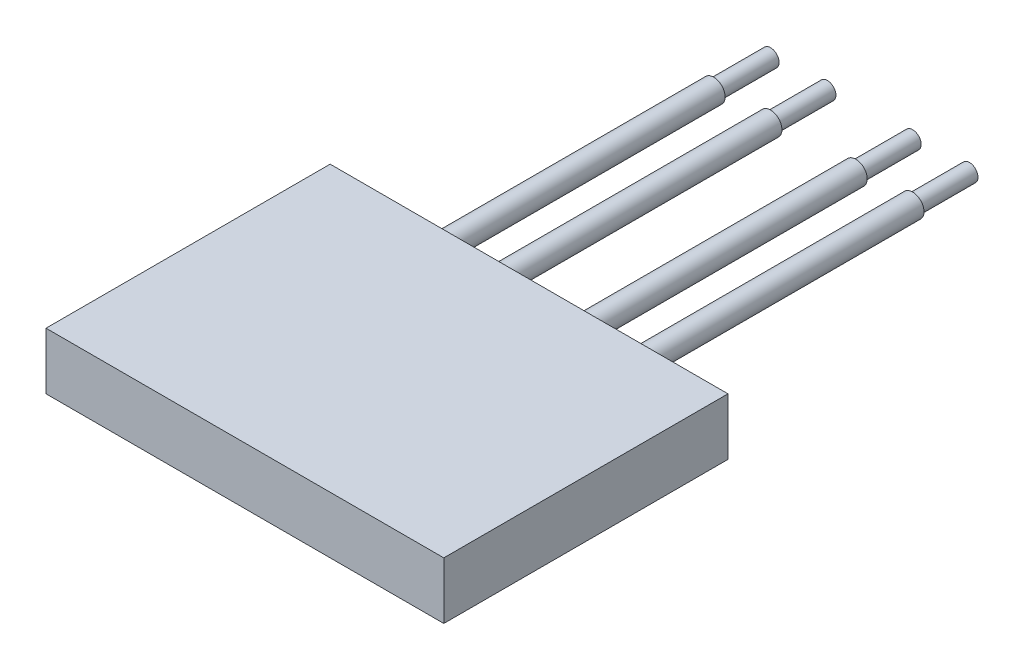
ISO-10303-21;
HEADER;
FILE_DESCRIPTION(('STEP AP214'),'2;1');
FILE_NAME('part.step','',(''),(''),'','','');
FILE_SCHEMA(('AUTOMOTIVE_DESIGN { 1 0 10303 214 1 1 1 1 }'));
ENDSEC;
DATA;
#1=APPLICATION_CONTEXT('core data for automotive mechanical design processes');
#2=APPLICATION_PROTOCOL_DEFINITION('international standard','automotive_design',2000,#1);
#3=PRODUCT_CONTEXT('',#1,'mechanical');
#4=PRODUCT('Part','Part','',(#3));
#5=PRODUCT_RELATED_PRODUCT_CATEGORY('part','',(#4));
#6=PRODUCT_DEFINITION_FORMATION('','',#4);
#7=PRODUCT_DEFINITION_CONTEXT('part definition',#1,'design');
#8=PRODUCT_DEFINITION('design','',#6,#7);
#9=PRODUCT_DEFINITION_SHAPE('','',#8);
#10=(LENGTH_UNIT() NAMED_UNIT(*) SI_UNIT(.MILLI.,.METRE.));
#11=(NAMED_UNIT(*) PLANE_ANGLE_UNIT() SI_UNIT($,.RADIAN.));
#12=(NAMED_UNIT(*) SI_UNIT($,.STERADIAN.) SOLID_ANGLE_UNIT());
#13=UNCERTAINTY_MEASURE_WITH_UNIT(LENGTH_MEASURE(1.E-05),#10,'distance_accuracy_value','');
#14=(GEOMETRIC_REPRESENTATION_CONTEXT(3) GLOBAL_UNCERTAINTY_ASSIGNED_CONTEXT((#13)) GLOBAL_UNIT_ASSIGNED_CONTEXT((#10,
#11,#12)) REPRESENTATION_CONTEXT('',''));
#15=CARTESIAN_POINT('',(0.,0.,0.));
#16=DIRECTION('',(0.,0.,1.));
#17=DIRECTION('',(1.,0.,0.));
#18=AXIS2_PLACEMENT_3D('',#15,#16,#17);
#19=CARTESIAN_POINT('',(6.5,1.5,-10.));
#20=DIRECTION('',(0.,1.,0.));
#21=DIRECTION('',(0.,0.,1.));
#22=AXIS2_PLACEMENT_3D('',#19,#20,#21);
#23=PLANE('',#22);
#24=DIRECTION('',(1.,0.,0.));
#25=VECTOR('',#24,1.);
#26=CARTESIAN_POINT('',(-6.5,1.5,-1.));
#27=LINE('',#26,#25);
#28=CARTESIAN_POINT('',(-6.5,1.5,-1.));
#29=VERTEX_POINT('',#28);
#30=CARTESIAN_POINT('',(6.5,1.5,-1.));
#31=VERTEX_POINT('',#30);
#32=EDGE_CURVE('E92',#29,#31,#27,.T.);
#33=ORIENTED_EDGE('',*,*,#32,.F.);
#34=DIRECTION('',(0.,0.,1.));
#35=VECTOR('',#34,1.);
#36=CARTESIAN_POINT('',(-6.5,1.5,-10.));
#37=LINE('',#36,#35);
#38=CARTESIAN_POINT('',(-6.5,1.5,-10.));
#39=VERTEX_POINT('',#38);
#40=EDGE_CURVE('E81',#39,#29,#37,.T.);
#41=ORIENTED_EDGE('',*,*,#40,.F.);
#42=DIRECTION('',(-1.,0.,0.));
#43=VECTOR('',#42,1.);
#44=CARTESIAN_POINT('',(6.5,1.5,-10.));
#45=LINE('',#44,#43);
#46=CARTESIAN_POINT('',(6.5,1.5,-10.));
#47=VERTEX_POINT('',#46);
#48=EDGE_CURVE('E91',#47,#39,#45,.T.);
#49=ORIENTED_EDGE('',*,*,#48,.F.);
#50=DIRECTION('',(0.,0.,1.));
#51=VECTOR('',#50,1.);
#52=CARTESIAN_POINT('',(6.5,1.5,-10.));
#53=LINE('',#52,#51);
#54=EDGE_CURVE('E104',#47,#31,#53,.T.);
#55=ORIENTED_EDGE('',*,*,#54,.T.);
#56=EDGE_LOOP('',(#33,#41,#49,#55));
#57=FACE_BOUND('',#56,.T.);
#58=ADVANCED_FACE('F17',(#57),#23,.F.);
#59=CARTESIAN_POINT('',(0.,0.,-1.));
#60=DIRECTION('',(0.,0.,1.));
#61=DIRECTION('',(1.,0.,0.));
#62=AXIS2_PLACEMENT_3D('',#59,#60,#61);
#63=PLANE('',#62);
#64=CARTESIAN_POINT('',(3.5,1.,-1.));
#65=DIRECTION('',(0.,0.,1.));
#66=DIRECTION('',(1.,0.,0.));
#67=AXIS2_PLACEMENT_3D('',#64,#65,#66);
#68=CIRCLE('',#67,0.4);
#69=CARTESIAN_POINT('',(3.9,1.,-1.));
#70=VERTEX_POINT('',#69);
#71=EDGE_CURVE('E115',#70,#70,#68,.T.);
#72=ORIENTED_EDGE('',*,*,#71,.T.);
#73=EDGE_LOOP('',(#72));
#74=FACE_BOUND('',#73,.T.);
#75=CARTESIAN_POINT('',(1.5,1.,-1.));
#76=DIRECTION('',(0.,0.,1.));
#77=DIRECTION('',(1.,0.,0.));
#78=AXIS2_PLACEMENT_3D('',#75,#76,#77);
#79=CIRCLE('',#78,0.4);
#80=CARTESIAN_POINT('',(1.9,1.,-1.));
#81=VERTEX_POINT('',#80);
#82=EDGE_CURVE('E120',#81,#81,#79,.T.);
#83=ORIENTED_EDGE('',*,*,#82,.T.);
#84=EDGE_LOOP('',(#83));
#85=FACE_BOUND('',#84,.T.);
#86=CARTESIAN_POINT('',(-1.5,1.,-1.));
#87=DIRECTION('',(0.,0.,1.));
#88=DIRECTION('',(1.,0.,0.));
#89=AXIS2_PLACEMENT_3D('',#86,#87,#88);
#90=CIRCLE('',#89,0.4);
#91=CARTESIAN_POINT('',(-1.1,1.,-1.));
#92=VERTEX_POINT('',#91);
#93=EDGE_CURVE('E123',#92,#92,#90,.T.);
#94=ORIENTED_EDGE('',*,*,#93,.T.);
#95=EDGE_LOOP('',(#94));
#96=FACE_BOUND('',#95,.T.);
#97=CARTESIAN_POINT('',(-3.5,1.,-1.));
#98=DIRECTION('',(0.,0.,1.));
#99=DIRECTION('',(1.,0.,0.));
#100=AXIS2_PLACEMENT_3D('',#97,#98,#99);
#101=CIRCLE('',#100,0.4);
#102=CARTESIAN_POINT('',(-3.1,1.,-1.));
#103=VERTEX_POINT('',#102);
#104=EDGE_CURVE('E101',#103,#103,#101,.T.);
#105=ORIENTED_EDGE('',*,*,#104,.T.);
#106=EDGE_LOOP('',(#105));
#107=FACE_BOUND('',#106,.T.);
#108=DIRECTION('',(0.,1.,0.));
#109=VECTOR('',#108,1.);
#110=CARTESIAN_POINT('',(-6.5,0.5,-1.));
#111=LINE('',#110,#109);
#112=CARTESIAN_POINT('',(-6.5,0.5,-1.));
#113=VERTEX_POINT('',#112);
#114=EDGE_CURVE('E85',#113,#29,#111,.T.);
#115=ORIENTED_EDGE('',*,*,#114,.T.);
#116=ORIENTED_EDGE('',*,*,#32,.T.);
#117=DIRECTION('',(0.,-1.,0.));
#118=VECTOR('',#117,1.);
#119=CARTESIAN_POINT('',(6.5,1.5,-1.));
#120=LINE('',#119,#118);
#121=CARTESIAN_POINT('',(6.5,0.5,-1.));
#122=VERTEX_POINT('',#121);
#123=EDGE_CURVE('E100',#31,#122,#120,.T.);
#124=ORIENTED_EDGE('',*,*,#123,.T.);
#125=DIRECTION('',(-1.,0.,0.));
#126=VECTOR('',#125,1.);
#127=CARTESIAN_POINT('',(6.5,0.5,-1.));
#128=LINE('',#127,#126);
#129=EDGE_CURVE('E99',#122,#113,#128,.T.);
#130=ORIENTED_EDGE('',*,*,#129,.T.);
#131=EDGE_LOOP('',(#115,#116,#124,#130));
#132=FACE_BOUND('',#131,.T.);
#133=ADVANCED_FACE('F97',(#74,#85,#96,#107,#132),#63,.F.);
#134=CARTESIAN_POINT('',(-6.5,1.5,-10.));
#135=DIRECTION('',(-1.,0.,0.));
#136=DIRECTION('',(0.,0.,1.));
#137=AXIS2_PLACEMENT_3D('',#134,#135,#136);
#138=PLANE('',#137);
#139=ORIENTED_EDGE('',*,*,#114,.F.);
#140=DIRECTION('',(0.,0.,1.));
#141=VECTOR('',#140,1.);
#142=CARTESIAN_POINT('',(-6.5,0.5,-10.));
#143=LINE('',#142,#141);
#144=CARTESIAN_POINT('',(-6.5,0.5,-10.));
#145=VERTEX_POINT('',#144);
#146=EDGE_CURVE('E134',#145,#113,#143,.T.);
#147=ORIENTED_EDGE('',*,*,#146,.F.);
#148=DIRECTION('',(0.,-1.,0.));
#149=VECTOR('',#148,1.);
#150=CARTESIAN_POINT('',(-6.5,1.5,-10.));
#151=LINE('',#150,#149);
#152=EDGE_CURVE('E87',#39,#145,#151,.T.);
#153=ORIENTED_EDGE('',*,*,#152,.F.);
#154=ORIENTED_EDGE('',*,*,#40,.T.);
#155=EDGE_LOOP('',(#139,#147,#153,#154));
#156=FACE_BOUND('',#155,.T.);
#157=ADVANCED_FACE('F83',(#156),#138,.F.);
#158=CARTESIAN_POINT('',(0.,0.,-10.));
#159=DIRECTION('',(0.,0.,1.));
#160=DIRECTION('',(1.,0.,0.));
#161=AXIS2_PLACEMENT_3D('',#158,#159,#160);
#162=PLANE('',#161);
#163=ORIENTED_EDGE('',*,*,#48,.T.);
#164=ORIENTED_EDGE('',*,*,#152,.T.);
#165=DIRECTION('',(1.,0.,0.));
#166=VECTOR('',#165,1.);
#167=CARTESIAN_POINT('',(-6.5,0.5,-10.));
#168=LINE('',#167,#166);
#169=CARTESIAN_POINT('',(6.5,0.5,-10.));
#170=VERTEX_POINT('',#169);
#171=EDGE_CURVE('E141',#145,#170,#168,.T.);
#172=ORIENTED_EDGE('',*,*,#171,.T.);
#173=DIRECTION('',(0.,1.,0.));
#174=VECTOR('',#173,1.);
#175=CARTESIAN_POINT('',(6.5,0.5,-10.));
#176=LINE('',#175,#174);
#177=EDGE_CURVE('E146',#170,#47,#176,.T.);
#178=ORIENTED_EDGE('',*,*,#177,.T.);
#179=EDGE_LOOP('',(#163,#164,#172,#178));
#180=FACE_BOUND('',#179,.T.);
#181=DIRECTION('',(-1.,0.,0.));
#182=VECTOR('',#181,1.);
#183=CARTESIAN_POINT('',(7.,2.,-10.));
#184=LINE('',#183,#182);
#185=CARTESIAN_POINT('',(7.,2.,-10.));
#186=VERTEX_POINT('',#185);
#187=CARTESIAN_POINT('',(-7.,2.,-10.));
#188=VERTEX_POINT('',#187);
#189=EDGE_CURVE('E151',#186,#188,#184,.T.);
#190=ORIENTED_EDGE('',*,*,#189,.F.);
#191=DIRECTION('',(0.,1.,0.));
#192=VECTOR('',#191,1.);
#193=CARTESIAN_POINT('',(7.,0.,-10.));
#194=LINE('',#193,#192);
#195=CARTESIAN_POINT('',(7.,0.,-10.));
#196=VERTEX_POINT('',#195);
#197=EDGE_CURVE('E156',#196,#186,#194,.T.);
#198=ORIENTED_EDGE('',*,*,#197,.F.);
#199=DIRECTION('',(1.,0.,0.));
#200=VECTOR('',#199,1.);
#201=CARTESIAN_POINT('',(-7.,0.,-10.));
#202=LINE('',#201,#200);
#203=CARTESIAN_POINT('',(-7.,0.,-10.));
#204=VERTEX_POINT('',#203);
#205=EDGE_CURVE('E160',#204,#196,#202,.T.);
#206=ORIENTED_EDGE('',*,*,#205,.F.);
#207=DIRECTION('',(0.,-1.,0.));
#208=VECTOR('',#207,1.);
#209=CARTESIAN_POINT('',(-7.,2.,-10.));
#210=LINE('',#209,#208);
#211=EDGE_CURVE('E164',#188,#204,#210,.T.);
#212=ORIENTED_EDGE('',*,*,#211,.F.);
#213=EDGE_LOOP('',(#190,#198,#206,#212));
#214=FACE_BOUND('',#213,.T.);
#215=ADVANCED_FACE('F266',(#180,#214),#162,.F.);
#216=CARTESIAN_POINT('',(6.5,0.5,-10.));
#217=DIRECTION('',(1.,0.,0.));
#218=DIRECTION('',(0.,0.,-1.));
#219=AXIS2_PLACEMENT_3D('',#216,#217,#218);
#220=PLANE('',#219);
#221=ORIENTED_EDGE('',*,*,#123,.F.);
#222=ORIENTED_EDGE('',*,*,#54,.F.);
#223=ORIENTED_EDGE('',*,*,#177,.F.);
#224=DIRECTION('',(0.,0.,1.));
#225=VECTOR('',#224,1.);
#226=CARTESIAN_POINT('',(6.5,0.5,-10.));
#227=LINE('',#226,#225);
#228=EDGE_CURVE('E168',#170,#122,#227,.T.);
#229=ORIENTED_EDGE('',*,*,#228,.T.);
#230=EDGE_LOOP('',(#221,#222,#223,#229));
#231=FACE_BOUND('',#230,.T.);
#232=ADVANCED_FACE('F269',(#231),#220,.F.);
#233=CARTESIAN_POINT('',(3.5,1.,-20.));
#234=DIRECTION('',(0.,0.,1.));
#235=DIRECTION('',(1.,0.,0.));
#236=AXIS2_PLACEMENT_3D('',#233,#234,#235);
#237=CYLINDRICAL_SURFACE('',#236,0.4);
#238=CARTESIAN_POINT('',(3.5,1.,-20.));
#239=DIRECTION('',(0.,0.,1.));
#240=DIRECTION('',(1.,0.,0.));
#241=AXIS2_PLACEMENT_3D('',#238,#239,#240);
#242=CIRCLE('',#241,0.4);
#243=CARTESIAN_POINT('',(3.9,1.,-20.));
#244=VERTEX_POINT('',#243);
#245=EDGE_CURVE('E173',#244,#244,#242,.T.);
#246=ORIENTED_EDGE('',*,*,#245,.T.);
#247=EDGE_LOOP('',(#246));
#248=FACE_BOUND('',#247,.T.);
#249=ORIENTED_EDGE('',*,*,#71,.F.);
#250=EDGE_LOOP('',(#249));
#251=FACE_BOUND('',#250,.T.);
#252=ADVANCED_FACE('F273',(#248,#251),#237,.T.);
#253=CARTESIAN_POINT('',(1.5,1.,-20.));
#254=DIRECTION('',(0.,0.,1.));
#255=DIRECTION('',(1.,0.,0.));
#256=AXIS2_PLACEMENT_3D('',#253,#254,#255);
#257=CYLINDRICAL_SURFACE('',#256,0.4);
#258=CARTESIAN_POINT('',(1.5,1.,-20.));
#259=DIRECTION('',(0.,0.,1.));
#260=DIRECTION('',(1.,0.,0.));
#261=AXIS2_PLACEMENT_3D('',#258,#259,#260);
#262=CIRCLE('',#261,0.4);
#263=CARTESIAN_POINT('',(1.9,1.,-20.));
#264=VERTEX_POINT('',#263);
#265=EDGE_CURVE('E178',#264,#264,#262,.T.);
#266=ORIENTED_EDGE('',*,*,#265,.T.);
#267=EDGE_LOOP('',(#266));
#268=FACE_BOUND('',#267,.T.);
#269=ORIENTED_EDGE('',*,*,#82,.F.);
#270=EDGE_LOOP('',(#269));
#271=FACE_BOUND('',#270,.T.);
#272=ADVANCED_FACE('F277',(#268,#271),#257,.T.);
#273=CARTESIAN_POINT('',(-1.5,1.,-20.));
#274=DIRECTION('',(0.,0.,1.));
#275=DIRECTION('',(1.,0.,0.));
#276=AXIS2_PLACEMENT_3D('',#273,#274,#275);
#277=CYLINDRICAL_SURFACE('',#276,0.4);
#278=CARTESIAN_POINT('',(-1.5,1.,-20.));
#279=DIRECTION('',(0.,0.,1.));
#280=DIRECTION('',(1.,0.,0.));
#281=AXIS2_PLACEMENT_3D('',#278,#279,#280);
#282=CIRCLE('',#281,0.4);
#283=CARTESIAN_POINT('',(-1.1,1.,-20.));
#284=VERTEX_POINT('',#283);
#285=EDGE_CURVE('E181',#284,#284,#282,.T.);
#286=ORIENTED_EDGE('',*,*,#285,.T.);
#287=EDGE_LOOP('',(#286));
#288=FACE_BOUND('',#287,.T.);
#289=ORIENTED_EDGE('',*,*,#93,.F.);
#290=EDGE_LOOP('',(#289));
#291=FACE_BOUND('',#290,.T.);
#292=ADVANCED_FACE('F281',(#288,#291),#277,.T.);
#293=CARTESIAN_POINT('',(-3.5,1.,-20.));
#294=DIRECTION('',(0.,0.,1.));
#295=DIRECTION('',(1.,0.,0.));
#296=AXIS2_PLACEMENT_3D('',#293,#294,#295);
#297=CYLINDRICAL_SURFACE('',#296,0.4);
#298=CARTESIAN_POINT('',(-3.5,1.,-20.));
#299=DIRECTION('',(0.,0.,1.));
#300=DIRECTION('',(1.,0.,0.));
#301=AXIS2_PLACEMENT_3D('',#298,#299,#300);
#302=CIRCLE('',#301,0.4);
#303=CARTESIAN_POINT('',(-3.1,1.,-20.));
#304=VERTEX_POINT('',#303);
#305=EDGE_CURVE('E184',#304,#304,#302,.T.);
#306=ORIENTED_EDGE('',*,*,#305,.T.);
#307=EDGE_LOOP('',(#306));
#308=FACE_BOUND('',#307,.T.);
#309=ORIENTED_EDGE('',*,*,#104,.F.);
#310=EDGE_LOOP('',(#309));
#311=FACE_BOUND('',#310,.T.);
#312=ADVANCED_FACE('F285',(#308,#311),#297,.T.);
#313=CARTESIAN_POINT('',(-6.5,0.5,-10.));
#314=DIRECTION('',(0.,-1.,0.));
#315=DIRECTION('',(0.,0.,-1.));
#316=AXIS2_PLACEMENT_3D('',#313,#314,#315);
#317=PLANE('',#316);
#318=ORIENTED_EDGE('',*,*,#129,.F.);
#319=ORIENTED_EDGE('',*,*,#228,.F.);
#320=ORIENTED_EDGE('',*,*,#171,.F.);
#321=ORIENTED_EDGE('',*,*,#146,.T.);
#322=EDGE_LOOP('',(#318,#319,#320,#321));
#323=FACE_BOUND('',#322,.T.);
#324=ADVANCED_FACE('F289',(#323),#317,.F.);
#325=CARTESIAN_POINT('',(7.,2.,-10.));
#326=DIRECTION('',(0.,1.,0.));
#327=DIRECTION('',(0.,0.,1.));
#328=AXIS2_PLACEMENT_3D('',#325,#326,#327);
#329=PLANE('',#328);
#330=DIRECTION('',(-1.,0.,0.));
#331=VECTOR('',#330,1.);
#332=CARTESIAN_POINT('',(7.,2.,0.));
#333=LINE('',#332,#331);
#334=CARTESIAN_POINT('',(7.,2.,0.));
#335=VERTEX_POINT('',#334);
#336=CARTESIAN_POINT('',(-7.,2.,0.));
#337=VERTEX_POINT('',#336);
#338=EDGE_CURVE('E187',#335,#337,#333,.T.);
#339=ORIENTED_EDGE('',*,*,#338,.F.);
#340=DIRECTION('',(0.,0.,1.));
#341=VECTOR('',#340,1.);
#342=CARTESIAN_POINT('',(7.,2.,-10.));
#343=LINE('',#342,#341);
#344=EDGE_CURVE('E189',#186,#335,#343,.T.);
#345=ORIENTED_EDGE('',*,*,#344,.F.);
#346=ORIENTED_EDGE('',*,*,#189,.T.);
#347=DIRECTION('',(0.,0.,1.));
#348=VECTOR('',#347,1.);
#349=CARTESIAN_POINT('',(-7.,2.,-10.));
#350=LINE('',#349,#348);
#351=EDGE_CURVE('E194',#188,#337,#350,.T.);
#352=ORIENTED_EDGE('',*,*,#351,.T.);
#353=EDGE_LOOP('',(#339,#345,#346,#352));
#354=FACE_BOUND('',#353,.T.);
#355=ADVANCED_FACE('F293',(#354),#329,.T.);
#356=CARTESIAN_POINT('',(7.,0.,-10.));
#357=DIRECTION('',(1.,0.,0.));
#358=DIRECTION('',(0.,0.,-1.));
#359=AXIS2_PLACEMENT_3D('',#356,#357,#358);
#360=PLANE('',#359);
#361=DIRECTION('',(0.,1.,0.));
#362=VECTOR('',#361,1.);
#363=CARTESIAN_POINT('',(7.,0.,0.));
#364=LINE('',#363,#362);
#365=CARTESIAN_POINT('',(7.,0.,0.));
#366=VERTEX_POINT('',#365);
#367=EDGE_CURVE('E199',#366,#335,#364,.T.);
#368=ORIENTED_EDGE('',*,*,#367,.F.);
#369=DIRECTION('',(0.,0.,1.));
#370=VECTOR('',#369,1.);
#371=CARTESIAN_POINT('',(7.,0.,-10.));
#372=LINE('',#371,#370);
#373=EDGE_CURVE('E203',#196,#366,#372,.T.);
#374=ORIENTED_EDGE('',*,*,#373,.F.);
#375=ORIENTED_EDGE('',*,*,#197,.T.);
#376=ORIENTED_EDGE('',*,*,#344,.T.);
#377=EDGE_LOOP('',(#368,#374,#375,#376));
#378=FACE_BOUND('',#377,.T.);
#379=ADVANCED_FACE('F297',(#378),#360,.T.);
#380=CARTESIAN_POINT('',(-7.,0.,-10.));
#381=DIRECTION('',(0.,-1.,0.));
#382=DIRECTION('',(0.,0.,-1.));
#383=AXIS2_PLACEMENT_3D('',#380,#381,#382);
#384=PLANE('',#383);
#385=DIRECTION('',(1.,0.,0.));
#386=VECTOR('',#385,1.);
#387=CARTESIAN_POINT('',(-7.,0.,0.));
#388=LINE('',#387,#386);
#389=CARTESIAN_POINT('',(-7.,0.,0.));
#390=VERTEX_POINT('',#389);
#391=EDGE_CURVE('E36',#390,#366,#388,.T.);
#392=ORIENTED_EDGE('',*,*,#391,.F.);
#393=DIRECTION('',(0.,0.,1.));
#394=VECTOR('',#393,1.);
#395=CARTESIAN_POINT('',(-7.,0.,-10.));
#396=LINE('',#395,#394);
#397=EDGE_CURVE('E211',#204,#390,#396,.T.);
#398=ORIENTED_EDGE('',*,*,#397,.F.);
#399=ORIENTED_EDGE('',*,*,#205,.T.);
#400=ORIENTED_EDGE('',*,*,#373,.T.);
#401=EDGE_LOOP('',(#392,#398,#399,#400));
#402=FACE_BOUND('',#401,.T.);
#403=ADVANCED_FACE('F301',(#402),#384,.T.);
#404=CARTESIAN_POINT('',(-7.,2.,-10.));
#405=DIRECTION('',(-1.,0.,0.));
#406=DIRECTION('',(0.,0.,1.));
#407=AXIS2_PLACEMENT_3D('',#404,#405,#406);
#408=PLANE('',#407);
#409=DIRECTION('',(0.,-1.,0.));
#410=VECTOR('',#409,1.);
#411=CARTESIAN_POINT('',(-7.,2.,0.));
#412=LINE('',#411,#410);
#413=EDGE_CURVE('E32',#337,#390,#412,.T.);
#414=ORIENTED_EDGE('',*,*,#413,.F.);
#415=ORIENTED_EDGE('',*,*,#351,.F.);
#416=ORIENTED_EDGE('',*,*,#211,.T.);
#417=ORIENTED_EDGE('',*,*,#397,.T.);
#418=EDGE_LOOP('',(#414,#415,#416,#417));
#419=FACE_BOUND('',#418,.T.);
#420=ADVANCED_FACE('F305',(#419),#408,.T.);
#421=CARTESIAN_POINT('',(3.5,1.,-20.));
#422=DIRECTION('',(0.,0.,1.));
#423=DIRECTION('',(1.,0.,0.));
#424=AXIS2_PLACEMENT_3D('',#421,#422,#423);
#425=PLANE('',#424);
#426=CARTESIAN_POINT('',(3.5,1.,-20.));
#427=DIRECTION('',(0.,0.,1.));
#428=DIRECTION('',(1.,0.,0.));
#429=AXIS2_PLACEMENT_3D('',#426,#427,#428);
#430=CIRCLE('',#429,0.3);
#431=CARTESIAN_POINT('',(3.8,1.,-20.));
#432=VERTEX_POINT('',#431);
#433=EDGE_CURVE('E219',#432,#432,#430,.T.);
#434=ORIENTED_EDGE('',*,*,#433,.T.);
#435=EDGE_LOOP('',(#434));
#436=FACE_BOUND('',#435,.T.);
#437=ORIENTED_EDGE('',*,*,#245,.F.);
#438=EDGE_LOOP('',(#437));
#439=FACE_BOUND('',#438,.T.);
#440=ADVANCED_FACE('F309',(#436,#439),#425,.F.);
#441=CARTESIAN_POINT('',(1.5,1.,-20.));
#442=DIRECTION('',(0.,0.,1.));
#443=DIRECTION('',(1.,0.,0.));
#444=AXIS2_PLACEMENT_3D('',#441,#442,#443);
#445=PLANE('',#444);
#446=CARTESIAN_POINT('',(1.5,1.,-20.));
#447=DIRECTION('',(0.,0.,1.));
#448=DIRECTION('',(1.,0.,0.));
#449=AXIS2_PLACEMENT_3D('',#446,#447,#448);
#450=CIRCLE('',#449,0.3);
#451=CARTESIAN_POINT('',(1.8,1.,-20.));
#452=VERTEX_POINT('',#451);
#453=EDGE_CURVE('E224',#452,#452,#450,.T.);
#454=ORIENTED_EDGE('',*,*,#453,.T.);
#455=EDGE_LOOP('',(#454));
#456=FACE_BOUND('',#455,.T.);
#457=ORIENTED_EDGE('',*,*,#265,.F.);
#458=EDGE_LOOP('',(#457));
#459=FACE_BOUND('',#458,.T.);
#460=ADVANCED_FACE('F313',(#456,#459),#445,.F.);
#461=CARTESIAN_POINT('',(-1.5,1.,-20.));
#462=DIRECTION('',(0.,0.,1.));
#463=DIRECTION('',(1.,0.,0.));
#464=AXIS2_PLACEMENT_3D('',#461,#462,#463);
#465=PLANE('',#464);
#466=CARTESIAN_POINT('',(-1.5,1.,-20.));
#467=DIRECTION('',(0.,0.,1.));
#468=DIRECTION('',(1.,0.,0.));
#469=AXIS2_PLACEMENT_3D('',#466,#467,#468);
#470=CIRCLE('',#469,0.3);
#471=CARTESIAN_POINT('',(-1.2,1.,-20.));
#472=VERTEX_POINT('',#471);
#473=EDGE_CURVE('E227',#472,#472,#470,.T.);
#474=ORIENTED_EDGE('',*,*,#473,.T.);
#475=EDGE_LOOP('',(#474));
#476=FACE_BOUND('',#475,.T.);
#477=ORIENTED_EDGE('',*,*,#285,.F.);
#478=EDGE_LOOP('',(#477));
#479=FACE_BOUND('',#478,.T.);
#480=ADVANCED_FACE('F317',(#476,#479),#465,.F.);
#481=CARTESIAN_POINT('',(-3.5,1.,-20.));
#482=DIRECTION('',(0.,0.,1.));
#483=DIRECTION('',(1.,0.,0.));
#484=AXIS2_PLACEMENT_3D('',#481,#482,#483);
#485=PLANE('',#484);
#486=CARTESIAN_POINT('',(-3.5,1.,-20.));
#487=DIRECTION('',(0.,0.,1.));
#488=DIRECTION('',(1.,0.,0.));
#489=AXIS2_PLACEMENT_3D('',#486,#487,#488);
#490=CIRCLE('',#489,0.3);
#491=CARTESIAN_POINT('',(-3.2,1.,-20.));
#492=VERTEX_POINT('',#491);
#493=EDGE_CURVE('E230',#492,#492,#490,.T.);
#494=ORIENTED_EDGE('',*,*,#493,.T.);
#495=EDGE_LOOP('',(#494));
#496=FACE_BOUND('',#495,.T.);
#497=ORIENTED_EDGE('',*,*,#305,.F.);
#498=EDGE_LOOP('',(#497));
#499=FACE_BOUND('',#498,.T.);
#500=ADVANCED_FACE('F321',(#496,#499),#485,.F.);
#501=CARTESIAN_POINT('',(0.,0.,0.));
#502=DIRECTION('',(0.,0.,1.));
#503=DIRECTION('',(1.,0.,0.));
#504=AXIS2_PLACEMENT_3D('',#501,#502,#503);
#505=PLANE('',#504);
#506=ORIENTED_EDGE('',*,*,#338,.T.);
#507=ORIENTED_EDGE('',*,*,#413,.T.);
#508=ORIENTED_EDGE('',*,*,#391,.T.);
#509=ORIENTED_EDGE('',*,*,#367,.T.);
#510=EDGE_LOOP('',(#506,#507,#508,#509));
#511=FACE_BOUND('',#510,.T.);
#512=ADVANCED_FACE('F325',(#511),#505,.T.);
#513=CARTESIAN_POINT('',(3.5,1.,-22.));
#514=DIRECTION('',(0.,0.,1.));
#515=DIRECTION('',(1.,0.,0.));
#516=AXIS2_PLACEMENT_3D('',#513,#514,#515);
#517=CYLINDRICAL_SURFACE('',#516,0.3);
#518=CARTESIAN_POINT('',(3.5,1.,-22.));
#519=DIRECTION('',(0.,0.,1.));
#520=DIRECTION('',(1.,0.,0.));
#521=AXIS2_PLACEMENT_3D('',#518,#519,#520);
#522=CIRCLE('',#521,0.3);
#523=CARTESIAN_POINT('',(3.8,1.,-22.));
#524=VERTEX_POINT('',#523);
#525=EDGE_CURVE('E233',#524,#524,#522,.T.);
#526=ORIENTED_EDGE('',*,*,#525,.T.);
#527=EDGE_LOOP('',(#526));
#528=FACE_BOUND('',#527,.T.);
#529=ORIENTED_EDGE('',*,*,#433,.F.);
#530=EDGE_LOOP('',(#529));
#531=FACE_BOUND('',#530,.T.);
#532=ADVANCED_FACE('F329',(#528,#531),#517,.T.);
#533=CARTESIAN_POINT('',(1.5,1.,-22.));
#534=DIRECTION('',(0.,0.,1.));
#535=DIRECTION('',(1.,0.,0.));
#536=AXIS2_PLACEMENT_3D('',#533,#534,#535);
#537=CYLINDRICAL_SURFACE('',#536,0.3);
#538=CARTESIAN_POINT('',(1.5,1.,-22.));
#539=DIRECTION('',(0.,0.,1.));
#540=DIRECTION('',(1.,0.,0.));
#541=AXIS2_PLACEMENT_3D('',#538,#539,#540);
#542=CIRCLE('',#541,0.3);
#543=CARTESIAN_POINT('',(1.8,1.,-22.));
#544=VERTEX_POINT('',#543);
#545=EDGE_CURVE('E236',#544,#544,#542,.T.);
#546=ORIENTED_EDGE('',*,*,#545,.T.);
#547=EDGE_LOOP('',(#546));
#548=FACE_BOUND('',#547,.T.);
#549=ORIENTED_EDGE('',*,*,#453,.F.);
#550=EDGE_LOOP('',(#549));
#551=FACE_BOUND('',#550,.T.);
#552=ADVANCED_FACE('F332',(#548,#551),#537,.T.);
#553=CARTESIAN_POINT('',(-1.5,1.,-22.));
#554=DIRECTION('',(0.,0.,1.));
#555=DIRECTION('',(1.,0.,0.));
#556=AXIS2_PLACEMENT_3D('',#553,#554,#555);
#557=CYLINDRICAL_SURFACE('',#556,0.3);
#558=CARTESIAN_POINT('',(-1.5,1.,-22.));
#559=DIRECTION('',(0.,0.,1.));
#560=DIRECTION('',(1.,0.,0.));
#561=AXIS2_PLACEMENT_3D('',#558,#559,#560);
#562=CIRCLE('',#561,0.3);
#563=CARTESIAN_POINT('',(-1.2,1.,-22.));
#564=VERTEX_POINT('',#563);
#565=EDGE_CURVE('E25',#564,#564,#562,.T.);
#566=ORIENTED_EDGE('',*,*,#565,.T.);
#567=EDGE_LOOP('',(#566));
#568=FACE_BOUND('',#567,.T.);
#569=ORIENTED_EDGE('',*,*,#473,.F.);
#570=EDGE_LOOP('',(#569));
#571=FACE_BOUND('',#570,.T.);
#572=ADVANCED_FACE('F241',(#568,#571),#557,.T.);
#573=CARTESIAN_POINT('',(-3.5,1.,-22.));
#574=DIRECTION('',(0.,0.,1.));
#575=DIRECTION('',(1.,0.,0.));
#576=AXIS2_PLACEMENT_3D('',#573,#574,#575);
#577=CYLINDRICAL_SURFACE('',#576,0.3);
#578=CARTESIAN_POINT('',(-3.5,1.,-22.));
#579=DIRECTION('',(0.,0.,1.));
#580=DIRECTION('',(1.,0.,0.));
#581=AXIS2_PLACEMENT_3D('',#578,#579,#580);
#582=CIRCLE('',#581,0.3);
#583=CARTESIAN_POINT('',(-3.2,1.,-22.));
#584=VERTEX_POINT('',#583);
#585=EDGE_CURVE('E11',#584,#584,#582,.T.);
#586=ORIENTED_EDGE('',*,*,#585,.T.);
#587=EDGE_LOOP('',(#586));
#588=FACE_BOUND('',#587,.T.);
#589=ORIENTED_EDGE('',*,*,#493,.F.);
#590=EDGE_LOOP('',(#589));
#591=FACE_BOUND('',#590,.T.);
#592=ADVANCED_FACE('F339',(#588,#591),#577,.T.);
#593=CARTESIAN_POINT('',(3.5,1.,-22.));
#594=DIRECTION('',(0.,0.,1.));
#595=DIRECTION('',(1.,0.,0.));
#596=AXIS2_PLACEMENT_3D('',#593,#594,#595);
#597=PLANE('',#596);
#598=ORIENTED_EDGE('',*,*,#525,.F.);
#599=EDGE_LOOP('',(#598));
#600=FACE_BOUND('',#599,.T.);
#601=ADVANCED_FACE('F253',(#600),#597,.F.);
#602=CARTESIAN_POINT('',(1.5,1.,-22.));
#603=DIRECTION('',(0.,0.,1.));
#604=DIRECTION('',(1.,0.,0.));
#605=AXIS2_PLACEMENT_3D('',#602,#603,#604);
#606=PLANE('',#605);
#607=ORIENTED_EDGE('',*,*,#545,.F.);
#608=EDGE_LOOP('',(#607));
#609=FACE_BOUND('',#608,.T.);
#610=ADVANCED_FACE('F246',(#609),#606,.F.);
#611=CARTESIAN_POINT('',(-1.5,1.,-22.));
#612=DIRECTION('',(0.,0.,1.));
#613=DIRECTION('',(1.,0.,0.));
#614=AXIS2_PLACEMENT_3D('',#611,#612,#613);
#615=PLANE('',#614);
#616=ORIENTED_EDGE('',*,*,#565,.F.);
#617=EDGE_LOOP('',(#616));
#618=FACE_BOUND('',#617,.T.);
#619=ADVANCED_FACE('F244',(#618),#615,.F.);
#620=CARTESIAN_POINT('',(-3.5,1.,-22.));
#621=DIRECTION('',(0.,0.,1.));
#622=DIRECTION('',(1.,0.,0.));
#623=AXIS2_PLACEMENT_3D('',#620,#621,#622);
#624=PLANE('',#623);
#625=ORIENTED_EDGE('',*,*,#585,.F.);
#626=EDGE_LOOP('',(#625));
#627=FACE_BOUND('',#626,.T.);
#628=ADVANCED_FACE('F19',(#627),#624,.F.);
#629=CLOSED_SHELL('',(#58,#133,#157,#215,#232,#252,#272,#292,#312,#324,#355,#379,#403,#420,#440,
#460,#480,#500,#512,#532,#552,#572,#592,#601,#610,#619,#628));
#630=MANIFOLD_SOLID_BREP('B1',#629);
#631=ADVANCED_BREP_SHAPE_REPRESENTATION('',(#18,#630),#14);
#632=SHAPE_DEFINITION_REPRESENTATION(#9,#631);
ENDSEC;
END-ISO-10303-21;
